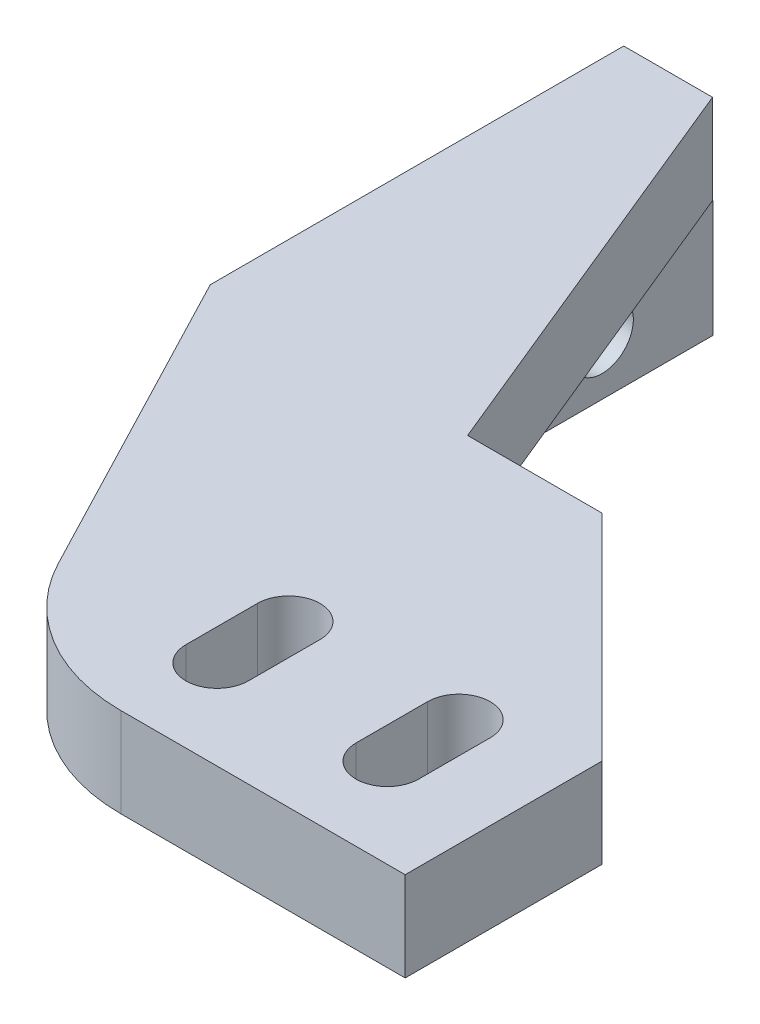
ISO-10303-21;
HEADER;
FILE_DESCRIPTION(('STEP AP214'),'2;1');
FILE_NAME('part.step','',(''),(''),'','','');
FILE_SCHEMA(('AUTOMOTIVE_DESIGN { 1 0 10303 214 1 1 1 1 }'));
ENDSEC;
DATA;
#1=APPLICATION_CONTEXT('core data for automotive mechanical design processes');
#2=APPLICATION_PROTOCOL_DEFINITION('international standard','automotive_design',2000,#1);
#3=PRODUCT_CONTEXT('',#1,'mechanical');
#4=PRODUCT('Part','Part','',(#3));
#5=PRODUCT_RELATED_PRODUCT_CATEGORY('part','',(#4));
#6=PRODUCT_DEFINITION_FORMATION('','',#4);
#7=PRODUCT_DEFINITION_CONTEXT('part definition',#1,'design');
#8=PRODUCT_DEFINITION('design','',#6,#7);
#9=PRODUCT_DEFINITION_SHAPE('','',#8);
#10=(LENGTH_UNIT() NAMED_UNIT(*) SI_UNIT(.MILLI.,.METRE.));
#11=(NAMED_UNIT(*) PLANE_ANGLE_UNIT() SI_UNIT($,.RADIAN.));
#12=(NAMED_UNIT(*) SI_UNIT($,.STERADIAN.) SOLID_ANGLE_UNIT());
#13=UNCERTAINTY_MEASURE_WITH_UNIT(LENGTH_MEASURE(1.E-05),#10,'distance_accuracy_value','');
#14=(GEOMETRIC_REPRESENTATION_CONTEXT(3) GLOBAL_UNCERTAINTY_ASSIGNED_CONTEXT((#13)) GLOBAL_UNIT_ASSIGNED_CONTEXT((#10,
#11,#12)) REPRESENTATION_CONTEXT('',''));
#15=CARTESIAN_POINT('',(0.,0.,0.));
#16=DIRECTION('',(0.,0.,1.));
#17=DIRECTION('',(1.,0.,0.));
#18=AXIS2_PLACEMENT_3D('',#15,#16,#17);
#19=CARTESIAN_POINT('',(9.10716575764116,45.,6.));
#20=DIRECTION('',(0.,-1.,0.));
#21=DIRECTION('',(0.,0.,-1.));
#22=AXIS2_PLACEMENT_3D('',#19,#20,#21);
#23=CYLINDRICAL_SURFACE('',#22,10.);
#24=DIRECTION('',(0.,-1.,0.));
#25=VECTOR('',#24,1.);
#26=CARTESIAN_POINT('',(9.10716575764116,45.,16.));
#27=LINE('',#26,#25);
#28=CARTESIAN_POINT('',(9.10716575764116,45.,16.));
#29=VERTEX_POINT('',#28);
#30=CARTESIAN_POINT('',(9.10716575764116,40.,16.));
#31=VERTEX_POINT('',#30);
#32=EDGE_CURVE('E195',#29,#31,#27,.T.);
#33=ORIENTED_EDGE('',*,*,#32,.F.);
#34=CARTESIAN_POINT('',(9.10716575764116,45.,6.));
#35=DIRECTION('',(0.,-1.,0.));
#36=DIRECTION('',(0.,0.,-1.));
#37=AXIS2_PLACEMENT_3D('',#34,#35,#36);
#38=CIRCLE('',#37,10.);
#39=CARTESIAN_POINT('',(0.239251540114023,45.,10.6216985438884));
#40=VERTEX_POINT('',#39);
#41=EDGE_CURVE('E314',#40,#29,#38,.F.);
#42=ORIENTED_EDGE('',*,*,#41,.F.);
#43=DIRECTION('',(0.,-1.,0.));
#44=VECTOR('',#43,1.);
#45=CARTESIAN_POINT('',(0.239251540114023,24.,10.6216985438884));
#46=LINE('',#45,#44);
#47=CARTESIAN_POINT('',(0.239251540114023,40.,10.6216985438884));
#48=VERTEX_POINT('',#47);
#49=EDGE_CURVE('E199',#48,#40,#46,.F.);
#50=ORIENTED_EDGE('',*,*,#49,.F.);
#51=CARTESIAN_POINT('',(9.10716575764116,40.,6.));
#52=DIRECTION('',(0.,-1.,0.));
#53=DIRECTION('',(0.,0.,-1.));
#54=AXIS2_PLACEMENT_3D('',#51,#52,#53);
#55=CIRCLE('',#54,10.);
#56=EDGE_CURVE('E316',#31,#48,#55,.T.);
#57=ORIENTED_EDGE('',*,*,#56,.F.);
#58=EDGE_LOOP('',(#33,#42,#50,#57));
#59=FACE_BOUND('',#58,.T.);
#60=ADVANCED_FACE('F33',(#59),#23,.T.);
#61=CARTESIAN_POINT('',(-4.,33.5,16.));
#62=DIRECTION('',(-1.,0.,0.));
#63=DIRECTION('',(0.,0.,1.));
#64=AXIS2_PLACEMENT_3D('',#61,#62,#63);
#65=PLANE('',#64);
#66=CARTESIAN_POINT('',(-4.,36.5,-24.));
#67=DIRECTION('',(-1.,0.,0.));
#68=DIRECTION('',(0.,0.,1.));
#69=AXIS2_PLACEMENT_3D('',#66,#67,#68);
#70=CIRCLE('',#69,1.75);
#71=CARTESIAN_POINT('',(-4.,36.5,-22.25));
#72=VERTEX_POINT('',#71);
#73=EDGE_CURVE('E222',#72,#72,#70,.T.);
#74=ORIENTED_EDGE('',*,*,#73,.T.);
#75=EDGE_LOOP('',(#74));
#76=FACE_BOUND('',#75,.T.);
#77=CARTESIAN_POINT('',(-4.,36.5,-14.));
#78=DIRECTION('',(-1.,0.,0.));
#79=DIRECTION('',(0.,0.,1.));
#80=AXIS2_PLACEMENT_3D('',#77,#78,#79);
#81=CIRCLE('',#80,1.75);
#82=CARTESIAN_POINT('',(-4.,36.5,-12.25));
#83=VERTEX_POINT('',#82);
#84=EDGE_CURVE('E309',#83,#83,#81,.T.);
#85=ORIENTED_EDGE('',*,*,#84,.T.);
#86=EDGE_LOOP('',(#85));
#87=FACE_BOUND('',#86,.T.);
#88=DIRECTION('',(0.,1.,0.));
#89=VECTOR('',#88,1.);
#90=CARTESIAN_POINT('',(-4.,33.5,-7.10617559455627));
#91=LINE('',#90,#89);
#92=CARTESIAN_POINT('',(-4.,33.5,-7.10617559455627));
#93=VERTEX_POINT('',#92);
#94=CARTESIAN_POINT('',(-4.,40.,-7.10617559455627));
#95=VERTEX_POINT('',#94);
#96=EDGE_CURVE('E181',#93,#95,#91,.T.);
#97=ORIENTED_EDGE('',*,*,#96,.F.);
#98=DIRECTION('',(0.,0.,1.));
#99=VECTOR('',#98,1.);
#100=CARTESIAN_POINT('',(-4.,33.5,16.));
#101=LINE('',#100,#99);
#102=CARTESIAN_POINT('',(-3.99999999999999,33.5,-30.2123511891126));
#103=VERTEX_POINT('',#102);
#104=EDGE_CURVE('E220',#103,#93,#101,.T.);
#105=ORIENTED_EDGE('',*,*,#104,.F.);
#106=DIRECTION('',(0.,1.,0.));
#107=VECTOR('',#106,1.);
#108=CARTESIAN_POINT('',(-3.99999999999999,33.5,-30.2123511891126));
#109=LINE('',#108,#107);
#110=CARTESIAN_POINT('',(-3.99999999999999,40.,-30.2123511891126));
#111=VERTEX_POINT('',#110);
#112=EDGE_CURVE('E217',#103,#111,#109,.T.);
#113=ORIENTED_EDGE('',*,*,#112,.T.);
#114=DIRECTION('',(0.,0.,1.));
#115=VECTOR('',#114,1.);
#116=CARTESIAN_POINT('',(-4.,40.,16.));
#117=LINE('',#116,#115);
#118=CARTESIAN_POINT('',(-4.,40.,-30.1225292653854));
#119=VERTEX_POINT('',#118);
#120=EDGE_CURVE('E194',#111,#119,#117,.T.);
#121=ORIENTED_EDGE('',*,*,#120,.T.);
#122=EDGE_CURVE('E174',#119,#95,#117,.T.);
#123=ORIENTED_EDGE('',*,*,#122,.T.);
#124=EDGE_LOOP('',(#97,#105,#113,#121,#123));
#125=FACE_BOUND('',#124,.T.);
#126=ADVANCED_FACE('F191',(#76,#87,#125),#65,.F.);
#127=CARTESIAN_POINT('',(0.,33.5,0.));
#128=DIRECTION('',(0.,-1.,0.));
#129=DIRECTION('',(0.,0.,-1.));
#130=AXIS2_PLACEMENT_3D('',#127,#128,#129);
#131=PLANE('',#130);
#132=ORIENTED_EDGE('',*,*,#104,.T.);
#133=DIRECTION('',(1.,0.,0.));
#134=VECTOR('',#133,1.);
#135=CARTESIAN_POINT('',(-4.,33.5,-7.10617559455627));
#136=LINE('',#135,#134);
#137=CARTESIAN_POINT('',(-9.,33.5,-7.10617559455627));
#138=VERTEX_POINT('',#137);
#139=EDGE_CURVE('E180',#138,#93,#136,.T.);
#140=ORIENTED_EDGE('',*,*,#139,.F.);
#141=DIRECTION('',(0.,0.,-1.));
#142=VECTOR('',#141,1.);
#143=CARTESIAN_POINT('',(-9.,33.5,16.));
#144=LINE('',#143,#142);
#145=CARTESIAN_POINT('',(-9.,33.5,-30.2123511891126));
#146=VERTEX_POINT('',#145);
#147=EDGE_CURVE('E213',#138,#146,#144,.T.);
#148=ORIENTED_EDGE('',*,*,#147,.T.);
#149=DIRECTION('',(1.,0.,0.));
#150=VECTOR('',#149,1.);
#151=CARTESIAN_POINT('',(-9.,33.5,-30.2123511891126));
#152=LINE('',#151,#150);
#153=EDGE_CURVE('E447',#146,#103,#152,.T.);
#154=ORIENTED_EDGE('',*,*,#153,.T.);
#155=EDGE_LOOP('',(#132,#140,#148,#154));
#156=FACE_BOUND('',#155,.T.);
#157=ADVANCED_FACE('F350',(#156),#131,.T.);
#158=CARTESIAN_POINT('',(3.04226557459521,24.,16.));
#159=DIRECTION('',(0.886791421752713,0.,-0.46216985438884));
#160=DIRECTION('',(-0.46216985438884,0.,-0.886791421752713));
#161=AXIS2_PLACEMENT_3D('',#158,#159,#160);
#162=PLANE('',#161);
#163=DIRECTION('',(0.46216985438884,0.,0.886791421752713));
#164=VECTOR('',#163,1.);
#165=CARTESIAN_POINT('',(-4.1651375124709,40.,2.17074832979718));
#166=LINE('',#165,#164);
#167=CARTESIAN_POINT('',(-9.,40.,-7.10617559455629));
#168=VERTEX_POINT('',#167);
#169=EDGE_CURVE('E177',#168,#48,#166,.T.);
#170=ORIENTED_EDGE('',*,*,#169,.T.);
#171=ORIENTED_EDGE('',*,*,#49,.T.);
#172=DIRECTION('',(-0.46216985438884,0.,-0.886791421752713));
#173=VECTOR('',#172,1.);
#174=CARTESIAN_POINT('',(3.04226557459521,45.,16.));
#175=LINE('',#174,#173);
#176=CARTESIAN_POINT('',(-9.,45.,-7.10617559455629));
#177=VERTEX_POINT('',#176);
#178=EDGE_CURVE('E469',#40,#177,#175,.T.);
#179=ORIENTED_EDGE('',*,*,#178,.T.);
#180=DIRECTION('',(0.,1.,0.));
#181=VECTOR('',#180,1.);
#182=CARTESIAN_POINT('',(-9.,24.,-7.10617559455629));
#183=LINE('',#182,#181);
#184=EDGE_CURVE('E433',#168,#177,#183,.T.);
#185=ORIENTED_EDGE('',*,*,#184,.F.);
#186=EDGE_LOOP('',(#170,#171,#179,#185));
#187=FACE_BOUND('',#186,.T.);
#188=ADVANCED_FACE('F379',(#187),#162,.F.);
#189=CARTESIAN_POINT('',(0.,45.,0.));
#190=DIRECTION('',(0.,-1.,0.));
#191=DIRECTION('',(0.,0.,-1.));
#192=AXIS2_PLACEMENT_3D('',#189,#190,#191);
#193=PLANE('',#192);
#194=CARTESIAN_POINT('',(19.,45.,11.));
#195=DIRECTION('',(0.,1.,0.));
#196=DIRECTION('',(0.,0.,1.));
#197=AXIS2_PLACEMENT_3D('',#194,#195,#196);
#198=CIRCLE('',#197,1.75);
#199=CARTESIAN_POINT('',(17.25,45.,11.));
#200=VERTEX_POINT('',#199);
#201=CARTESIAN_POINT('',(20.75,45.,11.));
#202=VERTEX_POINT('',#201);
#203=EDGE_CURVE('E254',#200,#202,#198,.T.);
#204=ORIENTED_EDGE('',*,*,#203,.F.);
#205=DIRECTION('',(0.,0.,1.));
#206=VECTOR('',#205,1.);
#207=CARTESIAN_POINT('',(17.25,45.,11.));
#208=LINE('',#207,#206);
#209=CARTESIAN_POINT('',(17.25,45.,7.));
#210=VERTEX_POINT('',#209);
#211=EDGE_CURVE('E262',#210,#200,#208,.T.);
#212=ORIENTED_EDGE('',*,*,#211,.F.);
#213=CARTESIAN_POINT('',(19.,45.,6.99999999999999));
#214=DIRECTION('',(0.,1.,0.));
#215=DIRECTION('',(0.,0.,1.));
#216=AXIS2_PLACEMENT_3D('',#213,#214,#215);
#217=CIRCLE('',#216,1.75);
#218=CARTESIAN_POINT('',(20.75,45.,7.));
#219=VERTEX_POINT('',#218);
#220=EDGE_CURVE('E259',#219,#210,#217,.T.);
#221=ORIENTED_EDGE('',*,*,#220,.F.);
#222=DIRECTION('',(0.,0.,-1.));
#223=VECTOR('',#222,1.);
#224=CARTESIAN_POINT('',(20.75,45.,11.));
#225=LINE('',#224,#223);
#226=EDGE_CURVE('E256',#202,#219,#225,.T.);
#227=ORIENTED_EDGE('',*,*,#226,.F.);
#228=EDGE_LOOP('',(#204,#212,#221,#227));
#229=FACE_BOUND('',#228,.T.);
#230=DIRECTION('',(0.,0.,-1.));
#231=VECTOR('',#230,1.);
#232=CARTESIAN_POINT('',(25.,45.,16.));
#233=LINE('',#232,#231);
#234=CARTESIAN_POINT('',(25.,45.,16.));
#235=VERTEX_POINT('',#234);
#236=CARTESIAN_POINT('',(25.,45.,5.00000000000005));
#237=VERTEX_POINT('',#236);
#238=EDGE_CURVE('E297',#235,#237,#233,.T.);
#239=ORIENTED_EDGE('',*,*,#238,.T.);
#240=DIRECTION('',(0.707106781186546,0.,0.707106781186549));
#241=VECTOR('',#240,1.);
#242=CARTESIAN_POINT('',(13.,45.,-7.));
#243=LINE('',#242,#241);
#244=CARTESIAN_POINT('',(13.,45.,-7.));
#245=VERTEX_POINT('',#244);
#246=EDGE_CURVE('E11',#237,#245,#243,.F.);
#247=ORIENTED_EDGE('',*,*,#246,.T.);
#248=DIRECTION('',(-1.,0.,0.));
#249=VECTOR('',#248,1.);
#250=CARTESIAN_POINT('',(25.,45.,-7.00000000000001));
#251=LINE('',#250,#249);
#252=CARTESIAN_POINT('',(5.48787303789017,45.,-7.));
#253=VERTEX_POINT('',#252);
#254=EDGE_CURVE('E285',#245,#253,#251,.T.);
#255=ORIENTED_EDGE('',*,*,#254,.T.);
#256=DIRECTION('',(-0.379614820608996,0.,-0.925144630841038));
#257=VECTOR('',#256,1.);
#258=CARTESIAN_POINT('',(-4.03685665173397,45.,-30.2123511891126));
#259=LINE('',#258,#257);
#260=CARTESIAN_POINT('',(-4.03685665173397,45.,-30.2123511891126));
#261=VERTEX_POINT('',#260);
#262=EDGE_CURVE('E287',#253,#261,#259,.T.);
#263=ORIENTED_EDGE('',*,*,#262,.T.);
#264=DIRECTION('',(-1.,0.,0.));
#265=VECTOR('',#264,1.);
#266=CARTESIAN_POINT('',(-9.,45.,-30.2123511891126));
#267=LINE('',#266,#265);
#268=CARTESIAN_POINT('',(-9.,45.,-30.2123511891126));
#269=VERTEX_POINT('',#268);
#270=EDGE_CURVE('E290',#261,#269,#267,.T.);
#271=ORIENTED_EDGE('',*,*,#270,.T.);
#272=DIRECTION('',(0.,0.,1.));
#273=VECTOR('',#272,1.);
#274=CARTESIAN_POINT('',(-9.,45.,16.));
#275=LINE('',#274,#273);
#276=EDGE_CURVE('E292',#269,#177,#275,.T.);
#277=ORIENTED_EDGE('',*,*,#276,.T.);
#278=ORIENTED_EDGE('',*,*,#178,.F.);
#279=ORIENTED_EDGE('',*,*,#41,.T.);
#280=DIRECTION('',(1.,0.,0.));
#281=VECTOR('',#280,1.);
#282=CARTESIAN_POINT('',(25.,45.,16.));
#283=LINE('',#282,#281);
#284=EDGE_CURVE('E295',#29,#235,#283,.T.);
#285=ORIENTED_EDGE('',*,*,#284,.T.);
#286=EDGE_LOOP('',(#239,#247,#255,#263,#271,#277,#278,#279,#285));
#287=FACE_BOUND('',#286,.T.);
#288=CARTESIAN_POINT('',(9.49056589028713,45.,11.));
#289=DIRECTION('',(0.,1.,0.));
#290=DIRECTION('',(0.,0.,1.));
#291=AXIS2_PLACEMENT_3D('',#288,#289,#290);
#292=CIRCLE('',#291,1.75);
#293=CARTESIAN_POINT('',(7.74056589028713,45.,11.));
#294=VERTEX_POINT('',#293);
#295=CARTESIAN_POINT('',(11.2405658902871,45.,11.));
#296=VERTEX_POINT('',#295);
#297=EDGE_CURVE('E223',#294,#296,#292,.T.);
#298=ORIENTED_EDGE('',*,*,#297,.F.);
#299=DIRECTION('',(0.,0.,1.));
#300=VECTOR('',#299,1.);
#301=CARTESIAN_POINT('',(7.74056589028713,45.,11.));
#302=LINE('',#301,#300);
#303=CARTESIAN_POINT('',(7.74056589028713,45.,7.));
#304=VERTEX_POINT('',#303);
#305=EDGE_CURVE('E231',#304,#294,#302,.T.);
#306=ORIENTED_EDGE('',*,*,#305,.F.);
#307=CARTESIAN_POINT('',(9.49056589028713,45.,6.99999999999999));
#308=DIRECTION('',(0.,1.,0.));
#309=DIRECTION('',(0.,0.,1.));
#310=AXIS2_PLACEMENT_3D('',#307,#308,#309);
#311=CIRCLE('',#310,1.75);
#312=CARTESIAN_POINT('',(11.2405658902871,45.,7.));
#313=VERTEX_POINT('',#312);
#314=EDGE_CURVE('E228',#313,#304,#311,.T.);
#315=ORIENTED_EDGE('',*,*,#314,.F.);
#316=DIRECTION('',(0.,0.,-1.));
#317=VECTOR('',#316,1.);
#318=CARTESIAN_POINT('',(11.2405658902871,45.,11.));
#319=LINE('',#318,#317);
#320=EDGE_CURVE('E225',#296,#313,#319,.T.);
#321=ORIENTED_EDGE('',*,*,#320,.F.);
#322=EDGE_LOOP('',(#298,#306,#315,#321));
#323=FACE_BOUND('',#322,.T.);
#324=ADVANCED_FACE('F336',(#229,#287,#323),#193,.F.);
#325=CARTESIAN_POINT('',(0.,40.,0.));
#326=DIRECTION('',(0.,-1.,0.));
#327=DIRECTION('',(0.,0.,-1.));
#328=AXIS2_PLACEMENT_3D('',#325,#326,#327);
#329=PLANE('',#328);
#330=DIRECTION('',(-1.,0.,0.));
#331=VECTOR('',#330,1.);
#332=CARTESIAN_POINT('',(25.,40.,-7.00000000000001));
#333=LINE('',#332,#331);
#334=CARTESIAN_POINT('',(13.,40.,-7.));
#335=VERTEX_POINT('',#334);
#336=CARTESIAN_POINT('',(5.48787303789017,40.,-7.));
#337=VERTEX_POINT('',#336);
#338=EDGE_CURVE('E284',#335,#337,#333,.T.);
#339=ORIENTED_EDGE('',*,*,#338,.F.);
#340=DIRECTION('',(-0.707106781186546,0.,-0.707106781186549));
#341=VECTOR('',#340,1.);
#342=CARTESIAN_POINT('',(10.,40.,-9.99999999999999));
#343=LINE('',#342,#341);
#344=CARTESIAN_POINT('',(25.,40.,5.00000000000004));
#345=VERTEX_POINT('',#344);
#346=EDGE_CURVE('E55',#335,#345,#343,.F.);
#347=ORIENTED_EDGE('',*,*,#346,.T.);
#348=DIRECTION('',(0.,0.,-1.));
#349=VECTOR('',#348,1.);
#350=CARTESIAN_POINT('',(25.,40.,16.));
#351=LINE('',#350,#349);
#352=CARTESIAN_POINT('',(25.,40.,16.));
#353=VERTEX_POINT('',#352);
#354=EDGE_CURVE('E288',#353,#345,#351,.T.);
#355=ORIENTED_EDGE('',*,*,#354,.F.);
#356=DIRECTION('',(1.,0.,0.));
#357=VECTOR('',#356,1.);
#358=CARTESIAN_POINT('',(25.,40.,16.));
#359=LINE('',#358,#357);
#360=EDGE_CURVE('E303',#31,#353,#359,.T.);
#361=ORIENTED_EDGE('',*,*,#360,.F.);
#362=ORIENTED_EDGE('',*,*,#56,.T.);
#363=ORIENTED_EDGE('',*,*,#169,.F.);
#364=DIRECTION('',(-1.,0.,0.));
#365=VECTOR('',#364,1.);
#366=CARTESIAN_POINT('',(-4.,40.,-7.10617559455627));
#367=LINE('',#366,#365);
#368=EDGE_CURVE('E168',#95,#168,#367,.T.);
#369=ORIENTED_EDGE('',*,*,#368,.F.);
#370=ORIENTED_EDGE('',*,*,#122,.F.);
#371=DIRECTION('',(-0.379614820608996,0.,-0.925144630841038));
#372=VECTOR('',#371,1.);
#373=CARTESIAN_POINT('',(-4.03685665173397,40.,-30.2123511891126));
#374=LINE('',#373,#372);
#375=EDGE_CURVE('E300',#337,#119,#374,.T.);
#376=ORIENTED_EDGE('',*,*,#375,.F.);
#377=EDGE_LOOP('',(#339,#347,#355,#361,#362,#363,#369,#370,#376));
#378=FACE_BOUND('',#377,.T.);
#379=DIRECTION('',(0.,0.,1.));
#380=VECTOR('',#379,1.);
#381=CARTESIAN_POINT('',(17.25,40.,11.));
#382=LINE('',#381,#380);
#383=CARTESIAN_POINT('',(17.25,40.,7.));
#384=VERTEX_POINT('',#383);
#385=CARTESIAN_POINT('',(17.25,40.,11.));
#386=VERTEX_POINT('',#385);
#387=EDGE_CURVE('E257',#384,#386,#382,.T.);
#388=ORIENTED_EDGE('',*,*,#387,.T.);
#389=CARTESIAN_POINT('',(19.,40.,11.));
#390=DIRECTION('',(0.,1.,0.));
#391=DIRECTION('',(0.,0.,1.));
#392=AXIS2_PLACEMENT_3D('',#389,#390,#391);
#393=CIRCLE('',#392,1.75);
#394=CARTESIAN_POINT('',(20.75,40.,11.));
#395=VERTEX_POINT('',#394);
#396=EDGE_CURVE('E253',#386,#395,#393,.T.);
#397=ORIENTED_EDGE('',*,*,#396,.T.);
#398=DIRECTION('',(0.,0.,-1.));
#399=VECTOR('',#398,1.);
#400=CARTESIAN_POINT('',(20.75,40.,11.));
#401=LINE('',#400,#399);
#402=CARTESIAN_POINT('',(20.75,40.,7.));
#403=VERTEX_POINT('',#402);
#404=EDGE_CURVE('E267',#395,#403,#401,.T.);
#405=ORIENTED_EDGE('',*,*,#404,.T.);
#406=CARTESIAN_POINT('',(19.,40.,6.99999999999999));
#407=DIRECTION('',(0.,1.,0.));
#408=DIRECTION('',(0.,0.,1.));
#409=AXIS2_PLACEMENT_3D('',#406,#407,#408);
#410=CIRCLE('',#409,1.75);
#411=EDGE_CURVE('E270',#403,#384,#410,.T.);
#412=ORIENTED_EDGE('',*,*,#411,.T.);
#413=EDGE_LOOP('',(#388,#397,#405,#412));
#414=FACE_BOUND('',#413,.T.);
#415=DIRECTION('',(0.,0.,1.));
#416=VECTOR('',#415,1.);
#417=CARTESIAN_POINT('',(7.74056589028713,40.,11.));
#418=LINE('',#417,#416);
#419=CARTESIAN_POINT('',(7.74056589028713,40.,7.));
#420=VERTEX_POINT('',#419);
#421=CARTESIAN_POINT('',(7.74056589028713,40.,11.));
#422=VERTEX_POINT('',#421);
#423=EDGE_CURVE('E226',#420,#422,#418,.T.);
#424=ORIENTED_EDGE('',*,*,#423,.T.);
#425=CARTESIAN_POINT('',(9.49056589028713,40.,11.));
#426=DIRECTION('',(0.,1.,0.));
#427=DIRECTION('',(0.,0.,1.));
#428=AXIS2_PLACEMENT_3D('',#425,#426,#427);
#429=CIRCLE('',#428,1.75);
#430=CARTESIAN_POINT('',(11.2405658902871,40.,11.));
#431=VERTEX_POINT('',#430);
#432=EDGE_CURVE('E219',#422,#431,#429,.T.);
#433=ORIENTED_EDGE('',*,*,#432,.T.);
#434=DIRECTION('',(0.,0.,-1.));
#435=VECTOR('',#434,1.);
#436=CARTESIAN_POINT('',(11.2405658902871,40.,11.));
#437=LINE('',#436,#435);
#438=CARTESIAN_POINT('',(11.2405658902871,40.,7.));
#439=VERTEX_POINT('',#438);
#440=EDGE_CURVE('E236',#431,#439,#437,.T.);
#441=ORIENTED_EDGE('',*,*,#440,.T.);
#442=CARTESIAN_POINT('',(9.49056589028713,40.,6.99999999999999));
#443=DIRECTION('',(0.,1.,0.));
#444=DIRECTION('',(0.,0.,1.));
#445=AXIS2_PLACEMENT_3D('',#442,#443,#444);
#446=CIRCLE('',#445,1.75);
#447=EDGE_CURVE('E239',#439,#420,#446,.T.);
#448=ORIENTED_EDGE('',*,*,#447,.T.);
#449=EDGE_LOOP('',(#424,#433,#441,#448));
#450=FACE_BOUND('',#449,.T.);
#451=ADVANCED_FACE('F170',(#378,#414,#450),#329,.T.);
#452=CARTESIAN_POINT('',(25.,45.,-7.00000000000001));
#453=DIRECTION('',(0.,0.,1.));
#454=DIRECTION('',(1.,0.,0.));
#455=AXIS2_PLACEMENT_3D('',#452,#453,#454);
#456=PLANE('',#455);
#457=ORIENTED_EDGE('',*,*,#254,.F.);
#458=DIRECTION('',(0.,-1.,0.));
#459=VECTOR('',#458,1.);
#460=CARTESIAN_POINT('',(13.,45.,-7.));
#461=LINE('',#460,#459);
#462=EDGE_CURVE('E318',#245,#335,#461,.T.);
#463=ORIENTED_EDGE('',*,*,#462,.T.);
#464=ORIENTED_EDGE('',*,*,#338,.T.);
#465=DIRECTION('',(0.,-1.,0.));
#466=VECTOR('',#465,1.);
#467=CARTESIAN_POINT('',(5.48787303789017,45.,-7.));
#468=LINE('',#467,#466);
#469=EDGE_CURVE('E196',#253,#337,#468,.T.);
#470=ORIENTED_EDGE('',*,*,#469,.F.);
#471=EDGE_LOOP('',(#457,#463,#464,#470));
#472=FACE_BOUND('',#471,.T.);
#473=ADVANCED_FACE('F324',(#472),#456,.F.);
#474=CARTESIAN_POINT('',(-4.03685665173397,45.,-30.2123511891126));
#475=DIRECTION('',(-0.925144630841037,0.,0.379614820608996));
#476=DIRECTION('',(0.379614820608996,0.,0.925144630841037));
#477=AXIS2_PLACEMENT_3D('',#474,#475,#476);
#478=PLANE('',#477);
#479=ORIENTED_EDGE('',*,*,#375,.T.);
#480=CARTESIAN_POINT('',(-4.03685665173397,40.,-30.2123511891126));
#481=VERTEX_POINT('',#480);
#482=EDGE_CURVE('E207',#119,#481,#374,.T.);
#483=ORIENTED_EDGE('',*,*,#482,.T.);
#484=DIRECTION('',(0.,-1.,0.));
#485=VECTOR('',#484,1.);
#486=CARTESIAN_POINT('',(-4.03685665173397,45.,-30.2123511891126));
#487=LINE('',#486,#485);
#488=EDGE_CURVE('E202',#261,#481,#487,.T.);
#489=ORIENTED_EDGE('',*,*,#488,.F.);
#490=ORIENTED_EDGE('',*,*,#262,.F.);
#491=ORIENTED_EDGE('',*,*,#469,.T.);
#492=EDGE_LOOP('',(#479,#483,#489,#490,#491));
#493=FACE_BOUND('',#492,.T.);
#494=ADVANCED_FACE('F331',(#493),#478,.F.);
#495=CARTESIAN_POINT('',(-9.,45.,-30.2123511891126));
#496=DIRECTION('',(0.,0.,1.));
#497=DIRECTION('',(1.,0.,0.));
#498=AXIS2_PLACEMENT_3D('',#495,#496,#497);
#499=PLANE('',#498);
#500=ORIENTED_EDGE('',*,*,#488,.T.);
#501=DIRECTION('',(1.,0.,0.));
#502=VECTOR('',#501,1.);
#503=CARTESIAN_POINT('',(-9.,40.,-30.2123511891126));
#504=LINE('',#503,#502);
#505=EDGE_CURVE('E214',#481,#111,#504,.T.);
#506=ORIENTED_EDGE('',*,*,#505,.T.);
#507=ORIENTED_EDGE('',*,*,#112,.F.);
#508=ORIENTED_EDGE('',*,*,#153,.F.);
#509=DIRECTION('',(0.,-1.,0.));
#510=VECTOR('',#509,1.);
#511=CARTESIAN_POINT('',(-9.,45.,-30.2123511891126));
#512=LINE('',#511,#510);
#513=EDGE_CURVE('E452',#269,#146,#512,.T.);
#514=ORIENTED_EDGE('',*,*,#513,.F.);
#515=ORIENTED_EDGE('',*,*,#270,.F.);
#516=EDGE_LOOP('',(#500,#506,#507,#508,#514,#515));
#517=FACE_BOUND('',#516,.T.);
#518=ADVANCED_FACE('F359',(#517),#499,.F.);
#519=CARTESIAN_POINT('',(-9.,45.,16.));
#520=DIRECTION('',(1.,0.,0.));
#521=DIRECTION('',(0.,0.,-1.));
#522=AXIS2_PLACEMENT_3D('',#519,#520,#521);
#523=PLANE('',#522);
#524=CARTESIAN_POINT('',(-9.,36.5,-14.));
#525=DIRECTION('',(-1.,0.,0.));
#526=DIRECTION('',(0.,0.,-1.));
#527=AXIS2_PLACEMENT_3D('',#524,#525,#526);
#528=CIRCLE('',#527,1.75);
#529=CARTESIAN_POINT('',(-9.,36.5,-15.75));
#530=VERTEX_POINT('',#529);
#531=EDGE_CURVE('E435',#530,#530,#528,.T.);
#532=ORIENTED_EDGE('',*,*,#531,.F.);
#533=EDGE_LOOP('',(#532));
#534=FACE_BOUND('',#533,.T.);
#535=CARTESIAN_POINT('',(-9.,36.5,-24.));
#536=DIRECTION('',(-1.,0.,0.));
#537=DIRECTION('',(0.,0.,1.));
#538=AXIS2_PLACEMENT_3D('',#535,#536,#537);
#539=CIRCLE('',#538,1.75);
#540=CARTESIAN_POINT('',(-9.,36.5,-22.25));
#541=VERTEX_POINT('',#540);
#542=EDGE_CURVE('E443',#541,#541,#539,.T.);
#543=ORIENTED_EDGE('',*,*,#542,.F.);
#544=EDGE_LOOP('',(#543));
#545=FACE_BOUND('',#544,.T.);
#546=ORIENTED_EDGE('',*,*,#147,.F.);
#547=EDGE_CURVE('E436',#138,#168,#183,.T.);
#548=ORIENTED_EDGE('',*,*,#547,.T.);
#549=ORIENTED_EDGE('',*,*,#184,.T.);
#550=ORIENTED_EDGE('',*,*,#276,.F.);
#551=ORIENTED_EDGE('',*,*,#513,.T.);
#552=EDGE_LOOP('',(#546,#548,#549,#550,#551));
#553=FACE_BOUND('',#552,.T.);
#554=ADVANCED_FACE('F362',(#534,#545,#553),#523,.F.);
#555=CARTESIAN_POINT('',(25.,45.,16.));
#556=DIRECTION('',(0.,0.,-1.));
#557=DIRECTION('',(-1.,0.,0.));
#558=AXIS2_PLACEMENT_3D('',#555,#556,#557);
#559=PLANE('',#558);
#560=ORIENTED_EDGE('',*,*,#284,.F.);
#561=ORIENTED_EDGE('',*,*,#32,.T.);
#562=ORIENTED_EDGE('',*,*,#360,.T.);
#563=DIRECTION('',(0.,-1.,0.));
#564=VECTOR('',#563,1.);
#565=CARTESIAN_POINT('',(25.,45.,16.));
#566=LINE('',#565,#564);
#567=EDGE_CURVE('E299',#235,#353,#566,.T.);
#568=ORIENTED_EDGE('',*,*,#567,.F.);
#569=EDGE_LOOP('',(#560,#561,#562,#568));
#570=FACE_BOUND('',#569,.T.);
#571=ADVANCED_FACE('F366',(#570),#559,.F.);
#572=CARTESIAN_POINT('',(25.,45.,16.));
#573=DIRECTION('',(-1.,0.,0.));
#574=DIRECTION('',(0.,0.,1.));
#575=AXIS2_PLACEMENT_3D('',#572,#573,#574);
#576=PLANE('',#575);
#577=ORIENTED_EDGE('',*,*,#354,.T.);
#578=DIRECTION('',(0.,1.,0.));
#579=VECTOR('',#578,1.);
#580=CARTESIAN_POINT('',(25.,45.,5.00000000000004));
#581=LINE('',#580,#579);
#582=EDGE_CURVE('E41',#345,#237,#581,.T.);
#583=ORIENTED_EDGE('',*,*,#582,.T.);
#584=ORIENTED_EDGE('',*,*,#238,.F.);
#585=ORIENTED_EDGE('',*,*,#567,.T.);
#586=EDGE_LOOP('',(#577,#583,#584,#585));
#587=FACE_BOUND('',#586,.T.);
#588=ADVANCED_FACE('F370',(#587),#576,.F.);
#589=CARTESIAN_POINT('',(19.,45.,11.));
#590=DIRECTION('',(0.,-1.,0.));
#591=DIRECTION('',(0.,0.,-1.));
#592=AXIS2_PLACEMENT_3D('',#589,#590,#591);
#593=CYLINDRICAL_SURFACE('',#592,1.75);
#594=ORIENTED_EDGE('',*,*,#396,.F.);
#595=DIRECTION('',(0.,-1.,0.));
#596=VECTOR('',#595,1.);
#597=CARTESIAN_POINT('',(17.25,45.,11.));
#598=LINE('',#597,#596);
#599=EDGE_CURVE('E264',#200,#386,#598,.T.);
#600=ORIENTED_EDGE('',*,*,#599,.F.);
#601=ORIENTED_EDGE('',*,*,#203,.T.);
#602=DIRECTION('',(0.,-1.,0.));
#603=VECTOR('',#602,1.);
#604=CARTESIAN_POINT('',(20.75,45.,11.));
#605=LINE('',#604,#603);
#606=EDGE_CURVE('E281',#202,#395,#605,.T.);
#607=ORIENTED_EDGE('',*,*,#606,.T.);
#608=EDGE_LOOP('',(#594,#600,#601,#607));
#609=FACE_BOUND('',#608,.T.);
#610=ADVANCED_FACE('F374',(#609),#593,.F.);
#611=CARTESIAN_POINT('',(20.75,45.,11.));
#612=DIRECTION('',(-1.,0.,0.));
#613=DIRECTION('',(0.,0.,1.));
#614=AXIS2_PLACEMENT_3D('',#611,#612,#613);
#615=PLANE('',#614);
#616=ORIENTED_EDGE('',*,*,#404,.F.);
#617=ORIENTED_EDGE('',*,*,#606,.F.);
#618=ORIENTED_EDGE('',*,*,#226,.T.);
#619=DIRECTION('',(0.,-1.,0.));
#620=VECTOR('',#619,1.);
#621=CARTESIAN_POINT('',(20.75,45.,7.));
#622=LINE('',#621,#620);
#623=EDGE_CURVE('E279',#219,#403,#622,.T.);
#624=ORIENTED_EDGE('',*,*,#623,.T.);
#625=EDGE_LOOP('',(#616,#617,#618,#624));
#626=FACE_BOUND('',#625,.T.);
#627=ADVANCED_FACE('F383',(#626),#615,.T.);
#628=CARTESIAN_POINT('',(19.,45.,6.99999999999999));
#629=DIRECTION('',(0.,-1.,0.));
#630=DIRECTION('',(0.,0.,-1.));
#631=AXIS2_PLACEMENT_3D('',#628,#629,#630);
#632=CYLINDRICAL_SURFACE('',#631,1.75);
#633=ORIENTED_EDGE('',*,*,#411,.F.);
#634=ORIENTED_EDGE('',*,*,#623,.F.);
#635=ORIENTED_EDGE('',*,*,#220,.T.);
#636=DIRECTION('',(0.,-1.,0.));
#637=VECTOR('',#636,1.);
#638=CARTESIAN_POINT('',(17.25,45.,7.));
#639=LINE('',#638,#637);
#640=EDGE_CURVE('E277',#210,#384,#639,.T.);
#641=ORIENTED_EDGE('',*,*,#640,.T.);
#642=EDGE_LOOP('',(#633,#634,#635,#641));
#643=FACE_BOUND('',#642,.T.);
#644=ADVANCED_FACE('F387',(#643),#632,.F.);
#645=CARTESIAN_POINT('',(17.25,45.,11.));
#646=DIRECTION('',(1.,0.,0.));
#647=DIRECTION('',(0.,0.,-1.));
#648=AXIS2_PLACEMENT_3D('',#645,#646,#647);
#649=PLANE('',#648);
#650=ORIENTED_EDGE('',*,*,#387,.F.);
#651=ORIENTED_EDGE('',*,*,#640,.F.);
#652=ORIENTED_EDGE('',*,*,#211,.T.);
#653=ORIENTED_EDGE('',*,*,#599,.T.);
#654=EDGE_LOOP('',(#650,#651,#652,#653));
#655=FACE_BOUND('',#654,.T.);
#656=ADVANCED_FACE('F391',(#655),#649,.T.);
#657=CARTESIAN_POINT('',(9.49056589028713,45.,11.));
#658=DIRECTION('',(0.,-1.,0.));
#659=DIRECTION('',(0.,0.,-1.));
#660=AXIS2_PLACEMENT_3D('',#657,#658,#659);
#661=CYLINDRICAL_SURFACE('',#660,1.75);
#662=ORIENTED_EDGE('',*,*,#432,.F.);
#663=DIRECTION('',(0.,-1.,0.));
#664=VECTOR('',#663,1.);
#665=CARTESIAN_POINT('',(7.74056589028713,45.,11.));
#666=LINE('',#665,#664);
#667=EDGE_CURVE('E233',#294,#422,#666,.T.);
#668=ORIENTED_EDGE('',*,*,#667,.F.);
#669=ORIENTED_EDGE('',*,*,#297,.T.);
#670=DIRECTION('',(0.,-1.,0.));
#671=VECTOR('',#670,1.);
#672=CARTESIAN_POINT('',(11.2405658902871,45.,11.));
#673=LINE('',#672,#671);
#674=EDGE_CURVE('E250',#296,#431,#673,.T.);
#675=ORIENTED_EDGE('',*,*,#674,.T.);
#676=EDGE_LOOP('',(#662,#668,#669,#675));
#677=FACE_BOUND('',#676,.T.);
#678=ADVANCED_FACE('F395',(#677),#661,.F.);
#679=CARTESIAN_POINT('',(11.2405658902871,45.,11.));
#680=DIRECTION('',(-1.,0.,0.));
#681=DIRECTION('',(0.,0.,1.));
#682=AXIS2_PLACEMENT_3D('',#679,#680,#681);
#683=PLANE('',#682);
#684=ORIENTED_EDGE('',*,*,#440,.F.);
#685=ORIENTED_EDGE('',*,*,#674,.F.);
#686=ORIENTED_EDGE('',*,*,#320,.T.);
#687=DIRECTION('',(0.,-1.,0.));
#688=VECTOR('',#687,1.);
#689=CARTESIAN_POINT('',(11.2405658902871,45.,7.));
#690=LINE('',#689,#688);
#691=EDGE_CURVE('E248',#313,#439,#690,.T.);
#692=ORIENTED_EDGE('',*,*,#691,.T.);
#693=EDGE_LOOP('',(#684,#685,#686,#692));
#694=FACE_BOUND('',#693,.T.);
#695=ADVANCED_FACE('F399',(#694),#683,.T.);
#696=CARTESIAN_POINT('',(9.49056589028713,45.,6.99999999999999));
#697=DIRECTION('',(0.,-1.,0.));
#698=DIRECTION('',(0.,0.,-1.));
#699=AXIS2_PLACEMENT_3D('',#696,#697,#698);
#700=CYLINDRICAL_SURFACE('',#699,1.75);
#701=ORIENTED_EDGE('',*,*,#447,.F.);
#702=ORIENTED_EDGE('',*,*,#691,.F.);
#703=ORIENTED_EDGE('',*,*,#314,.T.);
#704=DIRECTION('',(0.,-1.,0.));
#705=VECTOR('',#704,1.);
#706=CARTESIAN_POINT('',(7.74056589028713,45.,7.));
#707=LINE('',#706,#705);
#708=EDGE_CURVE('E246',#304,#420,#707,.T.);
#709=ORIENTED_EDGE('',*,*,#708,.T.);
#710=EDGE_LOOP('',(#701,#702,#703,#709));
#711=FACE_BOUND('',#710,.T.);
#712=ADVANCED_FACE('F403',(#711),#700,.F.);
#713=CARTESIAN_POINT('',(7.74056589028713,45.,11.));
#714=DIRECTION('',(1.,0.,0.));
#715=DIRECTION('',(0.,0.,-1.));
#716=AXIS2_PLACEMENT_3D('',#713,#714,#715);
#717=PLANE('',#716);
#718=ORIENTED_EDGE('',*,*,#423,.F.);
#719=ORIENTED_EDGE('',*,*,#708,.F.);
#720=ORIENTED_EDGE('',*,*,#305,.T.);
#721=ORIENTED_EDGE('',*,*,#667,.T.);
#722=EDGE_LOOP('',(#718,#719,#720,#721));
#723=FACE_BOUND('',#722,.T.);
#724=ADVANCED_FACE('F407',(#723),#717,.T.);
#725=CARTESIAN_POINT('',(0.,40.,0.));
#726=DIRECTION('',(0.,-1.,0.));
#727=DIRECTION('',(0.,0.,-1.));
#728=AXIS2_PLACEMENT_3D('',#725,#726,#727);
#729=PLANE('',#728);
#730=ORIENTED_EDGE('',*,*,#482,.F.);
#731=ORIENTED_EDGE('',*,*,#120,.F.);
#732=ORIENTED_EDGE('',*,*,#505,.F.);
#733=EDGE_LOOP('',(#730,#731,#732));
#734=FACE_BOUND('',#733,.T.);
#735=ADVANCED_FACE('F410',(#734),#729,.F.);
#736=CARTESIAN_POINT('',(-3.,36.5,-24.));
#737=DIRECTION('',(-1.,0.,0.));
#738=DIRECTION('',(0.,0.,1.));
#739=AXIS2_PLACEMENT_3D('',#736,#737,#738);
#740=CYLINDRICAL_SURFACE('',#739,1.75);
#741=ORIENTED_EDGE('',*,*,#542,.T.);
#742=EDGE_LOOP('',(#741));
#743=FACE_BOUND('',#742,.T.);
#744=ORIENTED_EDGE('',*,*,#73,.F.);
#745=EDGE_LOOP('',(#744));
#746=FACE_BOUND('',#745,.T.);
#747=ADVANCED_FACE('F415',(#743,#746),#740,.F.);
#748=CARTESIAN_POINT('',(-3.,36.5,-14.));
#749=DIRECTION('',(-1.,0.,0.));
#750=DIRECTION('',(0.,0.,1.));
#751=AXIS2_PLACEMENT_3D('',#748,#749,#750);
#752=CYLINDRICAL_SURFACE('',#751,1.75);
#753=ORIENTED_EDGE('',*,*,#531,.T.);
#754=EDGE_LOOP('',(#753));
#755=FACE_BOUND('',#754,.T.);
#756=ORIENTED_EDGE('',*,*,#84,.F.);
#757=EDGE_LOOP('',(#756));
#758=FACE_BOUND('',#757,.T.);
#759=ADVANCED_FACE('F343',(#755,#758),#752,.F.);
#760=CARTESIAN_POINT('',(0.,0.,-7.10617559455627));
#761=DIRECTION('',(0.,0.,1.));
#762=DIRECTION('',(1.,0.,0.));
#763=AXIS2_PLACEMENT_3D('',#760,#761,#762);
#764=PLANE('',#763);
#765=ORIENTED_EDGE('',*,*,#96,.T.);
#766=ORIENTED_EDGE('',*,*,#368,.T.);
#767=ORIENTED_EDGE('',*,*,#547,.F.);
#768=ORIENTED_EDGE('',*,*,#139,.T.);
#769=EDGE_LOOP('',(#765,#766,#767,#768));
#770=FACE_BOUND('',#769,.T.);
#771=ADVANCED_FACE('F184',(#770),#764,.T.);
#772=CARTESIAN_POINT('',(13.,45.,-7.));
#773=DIRECTION('',(-0.707106781186549,0.,0.707106781186546));
#774=DIRECTION('',(0.,-1.,0.));
#775=AXIS2_PLACEMENT_3D('',#772,#773,#774);
#776=PLANE('',#775);
#777=ORIENTED_EDGE('',*,*,#246,.F.);
#778=ORIENTED_EDGE('',*,*,#582,.F.);
#779=ORIENTED_EDGE('',*,*,#346,.F.);
#780=ORIENTED_EDGE('',*,*,#462,.F.);
#781=EDGE_LOOP('',(#777,#778,#779,#780));
#782=FACE_BOUND('',#781,.T.);
#783=ADVANCED_FACE('F35',(#782),#776,.F.);
#784=CLOSED_SHELL('',(#60,#126,#157,#188,#324,#451,#473,#494,#518,#554,#571,#588,#610,#627,#644,
#656,#678,#695,#712,#724,#735,#747,#759,#771,#783));
#785=MANIFOLD_SOLID_BREP('B2',#784);
#786=ADVANCED_BREP_SHAPE_REPRESENTATION('',(#18,#785),#14);
#787=SHAPE_DEFINITION_REPRESENTATION(#9,#786);
ENDSEC;
END-ISO-10303-21;
